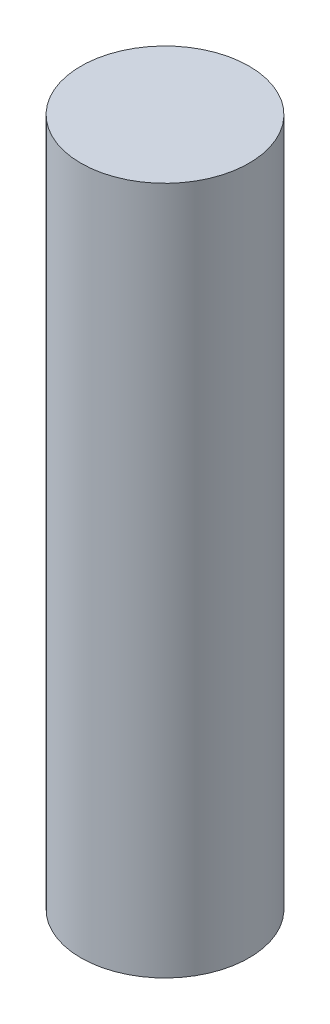
ISO-10303-21;
HEADER;
FILE_DESCRIPTION(('STEP AP214'),'2;1');
FILE_NAME('part.step','',(''),(''),'','','');
FILE_SCHEMA(('AUTOMOTIVE_DESIGN { 1 0 10303 214 1 1 1 1 }'));
ENDSEC;
DATA;
#1=APPLICATION_CONTEXT('core data for automotive mechanical design processes');
#2=APPLICATION_PROTOCOL_DEFINITION('international standard','automotive_design',2000,#1);
#3=PRODUCT_CONTEXT('',#1,'mechanical');
#4=PRODUCT('Part','Part','',(#3));
#5=PRODUCT_RELATED_PRODUCT_CATEGORY('part','',(#4));
#6=PRODUCT_DEFINITION_FORMATION('','',#4);
#7=PRODUCT_DEFINITION_CONTEXT('part definition',#1,'design');
#8=PRODUCT_DEFINITION('design','',#6,#7);
#9=PRODUCT_DEFINITION_SHAPE('','',#8);
#10=(LENGTH_UNIT() NAMED_UNIT(*) SI_UNIT(.MILLI.,.METRE.));
#11=(NAMED_UNIT(*) PLANE_ANGLE_UNIT() SI_UNIT($,.RADIAN.));
#12=(NAMED_UNIT(*) SI_UNIT($,.STERADIAN.) SOLID_ANGLE_UNIT());
#13=UNCERTAINTY_MEASURE_WITH_UNIT(LENGTH_MEASURE(1.E-05),#10,'distance_accuracy_value','');
#14=(GEOMETRIC_REPRESENTATION_CONTEXT(3) GLOBAL_UNCERTAINTY_ASSIGNED_CONTEXT((#13)) GLOBAL_UNIT_ASSIGNED_CONTEXT((#10,
#11,#12)) REPRESENTATION_CONTEXT('',''));
#15=CARTESIAN_POINT('',(0.,0.,0.));
#16=DIRECTION('',(0.,0.,1.));
#17=DIRECTION('',(1.,0.,0.));
#18=AXIS2_PLACEMENT_3D('',#15,#16,#17);
#19=CARTESIAN_POINT('',(0.,225.,0.));
#20=DIRECTION('',(0.,-1.,0.));
#21=DIRECTION('',(0.,0.,-1.));
#22=AXIS2_PLACEMENT_3D('',#19,#20,#21);
#23=CYLINDRICAL_SURFACE('',#22,27.5);
#24=CARTESIAN_POINT('',(0.,225.,0.));
#25=DIRECTION('',(0.,1.,0.));
#26=DIRECTION('',(0.,0.,1.));
#27=AXIS2_PLACEMENT_3D('',#24,#25,#26);
#28=CIRCLE('',#27,27.5);
#29=CARTESIAN_POINT('',(0.,225.,27.5));
#30=VERTEX_POINT('',#29);
#31=EDGE_CURVE('E10',#30,#30,#28,.T.);
#32=ORIENTED_EDGE('',*,*,#31,.F.);
#33=EDGE_LOOP('',(#32));
#34=FACE_BOUND('',#33,.T.);
#35=CARTESIAN_POINT('',(0.,0.,0.));
#36=DIRECTION('',(0.,1.,0.));
#37=DIRECTION('',(0.,0.,1.));
#38=AXIS2_PLACEMENT_3D('',#35,#36,#37);
#39=CIRCLE('',#38,27.5);
#40=CARTESIAN_POINT('',(0.,0.,27.5));
#41=VERTEX_POINT('',#40);
#42=EDGE_CURVE('E40',#41,#41,#39,.T.);
#43=ORIENTED_EDGE('',*,*,#42,.T.);
#44=EDGE_LOOP('',(#43));
#45=FACE_BOUND('',#44,.T.);
#46=ADVANCED_FACE('F37',(#34,#45),#23,.T.);
#47=CARTESIAN_POINT('',(0.,225.,0.));
#48=DIRECTION('',(0.,1.,0.));
#49=DIRECTION('',(0.,0.,1.));
#50=AXIS2_PLACEMENT_3D('',#47,#48,#49);
#51=PLANE('',#50);
#52=ORIENTED_EDGE('',*,*,#31,.T.);
#53=EDGE_LOOP('',(#52));
#54=FACE_BOUND('',#53,.T.);
#55=ADVANCED_FACE('F54',(#54),#51,.T.);
#56=CARTESIAN_POINT('',(0.,0.,0.));
#57=DIRECTION('',(0.,1.,0.));
#58=DIRECTION('',(0.,0.,1.));
#59=AXIS2_PLACEMENT_3D('',#56,#57,#58);
#60=PLANE('',#59);
#61=ORIENTED_EDGE('',*,*,#42,.F.);
#62=EDGE_LOOP('',(#61));
#63=FACE_BOUND('',#62,.T.);
#64=ADVANCED_FACE('F52',(#63),#60,.F.);
#65=CLOSED_SHELL('',(#46,#55,#64));
#66=MANIFOLD_SOLID_BREP('B2',#65);
#67=ADVANCED_BREP_SHAPE_REPRESENTATION('',(#18,#66),#14);
#68=SHAPE_DEFINITION_REPRESENTATION(#9,#67);
ENDSEC;
END-ISO-10303-21;
